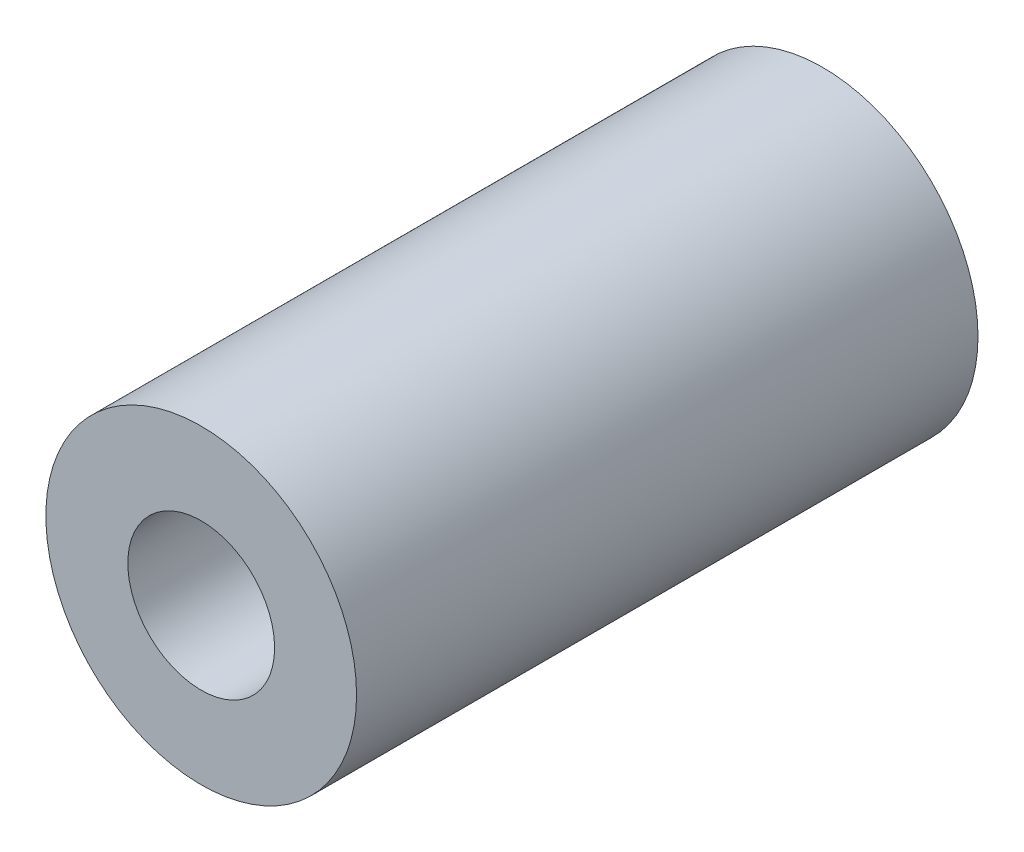
ISO-10303-21;
HEADER;
FILE_DESCRIPTION(('STEP AP214'),'2;1');
FILE_NAME('part.step','',(''),(''),'','','');
FILE_SCHEMA(('AUTOMOTIVE_DESIGN { 1 0 10303 214 1 1 1 1 }'));
ENDSEC;
DATA;
#1=APPLICATION_CONTEXT('core data for automotive mechanical design processes');
#2=APPLICATION_PROTOCOL_DEFINITION('international standard','automotive_design',2000,#1);
#3=PRODUCT_CONTEXT('',#1,'mechanical');
#4=PRODUCT('Part','Part','',(#3));
#5=PRODUCT_RELATED_PRODUCT_CATEGORY('part','',(#4));
#6=PRODUCT_DEFINITION_FORMATION('','',#4);
#7=PRODUCT_DEFINITION_CONTEXT('part definition',#1,'design');
#8=PRODUCT_DEFINITION('design','',#6,#7);
#9=PRODUCT_DEFINITION_SHAPE('','',#8);
#10=(LENGTH_UNIT() NAMED_UNIT(*) SI_UNIT(.MILLI.,.METRE.));
#11=(NAMED_UNIT(*) PLANE_ANGLE_UNIT() SI_UNIT($,.RADIAN.));
#12=(NAMED_UNIT(*) SI_UNIT($,.STERADIAN.) SOLID_ANGLE_UNIT());
#13=UNCERTAINTY_MEASURE_WITH_UNIT(LENGTH_MEASURE(1.E-05),#10,'distance_accuracy_value','');
#14=(GEOMETRIC_REPRESENTATION_CONTEXT(3) GLOBAL_UNCERTAINTY_ASSIGNED_CONTEXT((#13)) GLOBAL_UNIT_ASSIGNED_CONTEXT((#10,
#11,#12)) REPRESENTATION_CONTEXT('',''));
#15=CARTESIAN_POINT('',(0.,0.,0.));
#16=DIRECTION('',(0.,0.,1.));
#17=DIRECTION('',(1.,0.,0.));
#18=AXIS2_PLACEMENT_3D('',#15,#16,#17);
#19=CARTESIAN_POINT('',(0.,0.,19.05));
#20=DIRECTION('',(0.,0.,1.));
#21=DIRECTION('',(1.,0.,0.));
#22=AXIS2_PLACEMENT_3D('',#19,#20,#21);
#23=PLANE('',#22);
#24=CARTESIAN_POINT('',(0.,0.,19.05));
#25=DIRECTION('',(0.,0.,1.));
#26=DIRECTION('',(1.,0.,0.));
#27=AXIS2_PLACEMENT_3D('',#24,#25,#26);
#28=CIRCLE('',#27,4.7625);
#29=CARTESIAN_POINT('',(4.7625,0.,19.05));
#30=VERTEX_POINT('',#29);
#31=EDGE_CURVE('E10',#30,#30,#28,.T.);
#32=ORIENTED_EDGE('',*,*,#31,.T.);
#33=EDGE_LOOP('',(#32));
#34=FACE_BOUND('',#33,.T.);
#35=CARTESIAN_POINT('',(0.,0.,19.05));
#36=DIRECTION('',(0.,0.,1.));
#37=DIRECTION('',(1.,0.,0.));
#38=AXIS2_PLACEMENT_3D('',#35,#36,#37);
#39=CIRCLE('',#38,2.25);
#40=CARTESIAN_POINT('',(2.25,0.,19.05));
#41=VERTEX_POINT('',#40);
#42=EDGE_CURVE('E50',#41,#41,#39,.T.);
#43=ORIENTED_EDGE('',*,*,#42,.F.);
#44=EDGE_LOOP('',(#43));
#45=FACE_BOUND('',#44,.T.);
#46=ADVANCED_FACE('F37',(#34,#45),#23,.T.);
#47=CARTESIAN_POINT('',(0.,0.,0.));
#48=DIRECTION('',(0.,0.,1.));
#49=DIRECTION('',(1.,0.,0.));
#50=AXIS2_PLACEMENT_3D('',#47,#48,#49);
#51=PLANE('',#50);
#52=CARTESIAN_POINT('',(0.,0.,0.));
#53=DIRECTION('',(0.,0.,1.));
#54=DIRECTION('',(1.,0.,0.));
#55=AXIS2_PLACEMENT_3D('',#52,#53,#54);
#56=CIRCLE('',#55,4.7625);
#57=CARTESIAN_POINT('',(4.7625,0.,0.));
#58=VERTEX_POINT('',#57);
#59=EDGE_CURVE('E41',#58,#58,#56,.T.);
#60=ORIENTED_EDGE('',*,*,#59,.F.);
#61=EDGE_LOOP('',(#60));
#62=FACE_BOUND('',#61,.T.);
#63=CARTESIAN_POINT('',(0.,0.,0.));
#64=DIRECTION('',(0.,0.,1.));
#65=DIRECTION('',(1.,0.,0.));
#66=AXIS2_PLACEMENT_3D('',#63,#64,#65);
#67=CIRCLE('',#66,2.25);
#68=CARTESIAN_POINT('',(2.25,0.,0.));
#69=VERTEX_POINT('',#68);
#70=EDGE_CURVE('E52',#69,#69,#67,.T.);
#71=ORIENTED_EDGE('',*,*,#70,.T.);
#72=EDGE_LOOP('',(#71));
#73=FACE_BOUND('',#72,.T.);
#74=ADVANCED_FACE('F64',(#62,#73),#51,.F.);
#75=CARTESIAN_POINT('',(0.,0.,19.05));
#76=DIRECTION('',(0.,0.,-1.));
#77=DIRECTION('',(-1.,0.,0.));
#78=AXIS2_PLACEMENT_3D('',#75,#76,#77);
#79=CYLINDRICAL_SURFACE('',#78,4.7625);
#80=ORIENTED_EDGE('',*,*,#31,.F.);
#81=EDGE_LOOP('',(#80));
#82=FACE_BOUND('',#81,.T.);
#83=ORIENTED_EDGE('',*,*,#59,.T.);
#84=EDGE_LOOP('',(#83));
#85=FACE_BOUND('',#84,.T.);
#86=ADVANCED_FACE('F39',(#82,#85),#79,.T.);
#87=CARTESIAN_POINT('',(0.,0.,19.05));
#88=DIRECTION('',(0.,0.,-1.));
#89=DIRECTION('',(-1.,0.,0.));
#90=AXIS2_PLACEMENT_3D('',#87,#88,#89);
#91=CYLINDRICAL_SURFACE('',#90,2.25);
#92=ORIENTED_EDGE('',*,*,#42,.T.);
#93=EDGE_LOOP('',(#92));
#94=FACE_BOUND('',#93,.T.);
#95=ORIENTED_EDGE('',*,*,#70,.F.);
#96=EDGE_LOOP('',(#95));
#97=FACE_BOUND('',#96,.T.);
#98=ADVANCED_FACE('F60',(#94,#97),#91,.F.);
#99=CLOSED_SHELL('',(#46,#74,#86,#98));
#100=MANIFOLD_SOLID_BREP('B2',#99);
#101=ADVANCED_BREP_SHAPE_REPRESENTATION('',(#18,#100),#14);
#102=SHAPE_DEFINITION_REPRESENTATION(#9,#101);
ENDSEC;
END-ISO-10303-21;
